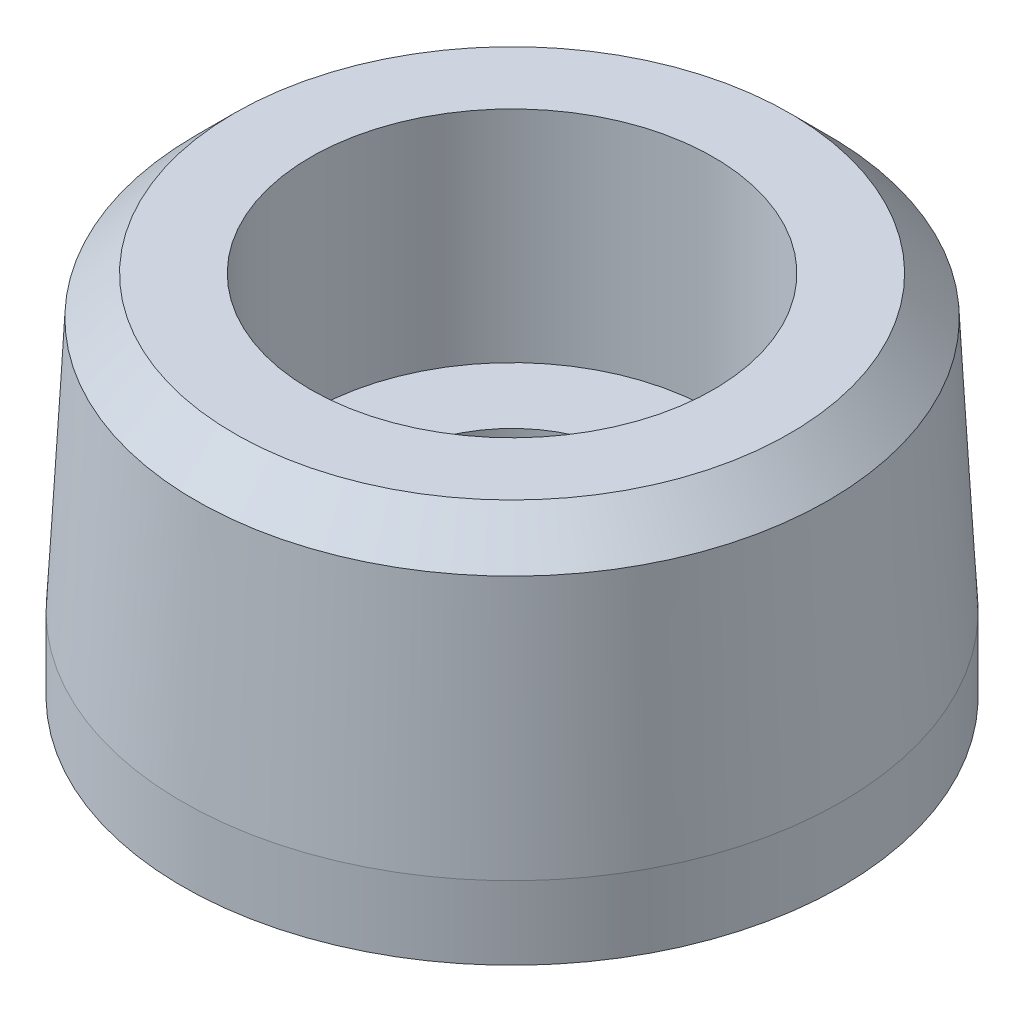
ISO-10303-21;
HEADER;
FILE_DESCRIPTION(('STEP AP214'),'2;1');
FILE_NAME('part.step','',(''),(''),'','','');
FILE_SCHEMA(('AUTOMOTIVE_DESIGN { 1 0 10303 214 1 1 1 1 }'));
ENDSEC;
DATA;
#1=APPLICATION_CONTEXT('core data for automotive mechanical design processes');
#2=APPLICATION_PROTOCOL_DEFINITION('international standard','automotive_design',2000,#1);
#3=PRODUCT_CONTEXT('',#1,'mechanical');
#4=PRODUCT('Part','Part','',(#3));
#5=PRODUCT_RELATED_PRODUCT_CATEGORY('part','',(#4));
#6=PRODUCT_DEFINITION_FORMATION('','',#4);
#7=PRODUCT_DEFINITION_CONTEXT('part definition',#1,'design');
#8=PRODUCT_DEFINITION('design','',#6,#7);
#9=PRODUCT_DEFINITION_SHAPE('','',#8);
#10=(LENGTH_UNIT() NAMED_UNIT(*) SI_UNIT(.MILLI.,.METRE.));
#11=(NAMED_UNIT(*) PLANE_ANGLE_UNIT() SI_UNIT($,.RADIAN.));
#12=(NAMED_UNIT(*) SI_UNIT($,.STERADIAN.) SOLID_ANGLE_UNIT());
#13=UNCERTAINTY_MEASURE_WITH_UNIT(LENGTH_MEASURE(1.E-05),#10,'distance_accuracy_value','');
#14=(GEOMETRIC_REPRESENTATION_CONTEXT(3) GLOBAL_UNCERTAINTY_ASSIGNED_CONTEXT((#13)) GLOBAL_UNIT_ASSIGNED_CONTEXT((#10,
#11,#12)) REPRESENTATION_CONTEXT('',''));
#15=CARTESIAN_POINT('',(0.,0.,0.));
#16=DIRECTION('',(0.,0.,1.));
#17=DIRECTION('',(1.,0.,0.));
#18=AXIS2_PLACEMENT_3D('',#15,#16,#17);
#19=CARTESIAN_POINT('',(0.,0.,0.));
#20=DIRECTION('',(0.,-1.,0.));
#21=DIRECTION('',(1.,0.,0.));
#22=AXIS2_PLACEMENT_3D('',#19,#20,#21);
#23=PLANE('',#22);
#24=CARTESIAN_POINT('',(0.,0.,0.));
#25=DIRECTION('',(0.,1.,0.));
#26=DIRECTION('',(0.,0.,1.));
#27=AXIS2_PLACEMENT_3D('',#24,#25,#26);
#28=CIRCLE('',#27,3.3);
#29=CARTESIAN_POINT('',(0.,0.,3.3));
#30=VERTEX_POINT('',#29);
#31=EDGE_CURVE('E53',#30,#30,#28,.T.);
#32=ORIENTED_EDGE('',*,*,#31,.T.);
#33=EDGE_LOOP('',(#32));
#34=FACE_BOUND('',#33,.T.);
#35=CARTESIAN_POINT('',(0.,0.,0.));
#36=DIRECTION('',(0.,-1.,0.));
#37=DIRECTION('',(1.,0.,0.));
#38=AXIS2_PLACEMENT_3D('',#35,#36,#37);
#39=CIRCLE('',#38,9.);
#40=CARTESIAN_POINT('',(9.,0.,0.));
#41=VERTEX_POINT('',#40);
#42=EDGE_CURVE('E44',#41,#41,#39,.T.);
#43=ORIENTED_EDGE('',*,*,#42,.T.);
#44=EDGE_LOOP('',(#43));
#45=FACE_BOUND('',#44,.T.);
#46=ADVANCED_FACE('F33',(#34,#45),#23,.T.);
#47=CARTESIAN_POINT('',(3.49148336110938E-12,-1000.,0.));
#48=DIRECTION('',(0.,-1.,0.));
#49=DIRECTION('',(1.,0.,0.));
#50=AXIS2_PLACEMENT_3D('',#47,#48,#49);
#51=CYLINDRICAL_SURFACE('',#50,9.);
#52=CARTESIAN_POINT('',(0.,2.,0.));
#53=DIRECTION('',(0.,-1.,0.));
#54=DIRECTION('',(1.,0.,0.));
#55=AXIS2_PLACEMENT_3D('',#52,#53,#54);
#56=CIRCLE('',#55,9.00000000000001);
#57=CARTESIAN_POINT('',(9.,2.00000000000003,0.));
#58=VERTEX_POINT('',#57);
#59=EDGE_CURVE('E48',#58,#58,#56,.T.);
#60=ORIENTED_EDGE('',*,*,#59,.T.);
#61=EDGE_LOOP('',(#60));
#62=FACE_BOUND('',#61,.T.);
#63=ORIENTED_EDGE('',*,*,#42,.F.);
#64=EDGE_LOOP('',(#63));
#65=FACE_BOUND('',#64,.T.);
#66=ADVANCED_FACE('F80',(#62,#65),#51,.T.);
#67=CARTESIAN_POINT('',(0.,2.,0.));
#68=DIRECTION('',(0.,-1.,0.));
#69=DIRECTION('',(1.,0.,0.));
#70=AXIS2_PLACEMENT_3D('',#67,#68,#69);
#71=CONICAL_SURFACE('',#70,9.00000000000001,0.0523598775598269);
#72=CARTESIAN_POINT('',(0.,8.94469374258541,0.));
#73=DIRECTION('',(0.,1.,0.));
#74=DIRECTION('',(-1.,0.,0.));
#75=AXIS2_PLACEMENT_3D('',#72,#73,#74);
#76=CIRCLE('',#75,8.63604402315029);
#77=CARTESIAN_POINT('',(-8.63604402315033,8.94469374258538,0.));
#78=VERTEX_POINT('',#77);
#79=EDGE_CURVE('E40',#78,#78,#76,.F.);
#80=ORIENTED_EDGE('',*,*,#79,.T.);
#81=EDGE_LOOP('',(#80));
#82=FACE_BOUND('',#81,.T.);
#83=ORIENTED_EDGE('',*,*,#59,.F.);
#84=EDGE_LOOP('',(#83));
#85=FACE_BOUND('',#84,.T.);
#86=ADVANCED_FACE('F71',(#82,#85),#71,.T.);
#87=CARTESIAN_POINT('',(8.58073776573567,10.,0.));
#88=DIRECTION('',(0.,1.,0.));
#89=DIRECTION('',(-1.,0.,0.));
#90=AXIS2_PLACEMENT_3D('',#87,#88,#89);
#91=PLANE('',#90);
#92=CARTESIAN_POINT('',(0.,9.99999999999998,0.));
#93=DIRECTION('',(0.,1.,0.));
#94=DIRECTION('',(-1.,0.,0.));
#95=AXIS2_PLACEMENT_3D('',#92,#93,#94);
#96=CIRCLE('',#95,7.58073776573572);
#97=CARTESIAN_POINT('',(-7.58073776573576,9.99999999999996,0.));
#98=VERTEX_POINT('',#97);
#99=EDGE_CURVE('E10',#98,#98,#96,.T.);
#100=ORIENTED_EDGE('',*,*,#99,.T.);
#101=EDGE_LOOP('',(#100));
#102=FACE_BOUND('',#101,.T.);
#103=CARTESIAN_POINT('',(0.,9.99999999999998,0.));
#104=DIRECTION('',(0.,1.,0.));
#105=DIRECTION('',(0.,0.,1.));
#106=AXIS2_PLACEMENT_3D('',#103,#104,#105);
#107=CIRCLE('',#106,5.5);
#108=CARTESIAN_POINT('',(0.,9.99999999999998,5.5));
#109=VERTEX_POINT('',#108);
#110=EDGE_CURVE('E62',#109,#109,#107,.T.);
#111=ORIENTED_EDGE('',*,*,#110,.F.);
#112=EDGE_LOOP('',(#111));
#113=FACE_BOUND('',#112,.T.);
#114=ADVANCED_FACE('F68',(#102,#113),#91,.T.);
#115=CARTESIAN_POINT('',(0.,9.99999999999998,0.));
#116=DIRECTION('',(0.,1.,0.));
#117=DIRECTION('',(0.,0.,1.));
#118=AXIS2_PLACEMENT_3D('',#115,#116,#117);
#119=CYLINDRICAL_SURFACE('',#118,3.3);
#120=ORIENTED_EDGE('',*,*,#31,.F.);
#121=EDGE_LOOP('',(#120));
#122=FACE_BOUND('',#121,.T.);
#123=CARTESIAN_POINT('',(0.,3.99999999999998,0.));
#124=DIRECTION('',(0.,1.,0.));
#125=DIRECTION('',(0.,0.,1.));
#126=AXIS2_PLACEMENT_3D('',#123,#124,#125);
#127=CIRCLE('',#126,3.3);
#128=CARTESIAN_POINT('',(0.,3.99999999999998,3.3));
#129=VERTEX_POINT('',#128);
#130=EDGE_CURVE('E56',#129,#129,#127,.T.);
#131=ORIENTED_EDGE('',*,*,#130,.T.);
#132=EDGE_LOOP('',(#131));
#133=FACE_BOUND('',#132,.T.);
#134=ADVANCED_FACE('F70',(#122,#133),#119,.F.);
#135=CARTESIAN_POINT('',(3.29999999999996,3.99999999999998,0.));
#136=DIRECTION('',(0.,-1.,0.));
#137=DIRECTION('',(0.,0.,-1.));
#138=AXIS2_PLACEMENT_3D('',#135,#136,#137);
#139=PLANE('',#138);
#140=ORIENTED_EDGE('',*,*,#130,.F.);
#141=EDGE_LOOP('',(#140));
#142=FACE_BOUND('',#141,.T.);
#143=CARTESIAN_POINT('',(0.,3.99999999999998,0.));
#144=DIRECTION('',(0.,1.,0.));
#145=DIRECTION('',(0.,0.,1.));
#146=AXIS2_PLACEMENT_3D('',#143,#144,#145);
#147=CIRCLE('',#146,5.5);
#148=CARTESIAN_POINT('',(0.,3.99999999999998,5.5));
#149=VERTEX_POINT('',#148);
#150=EDGE_CURVE('E59',#149,#149,#147,.T.);
#151=ORIENTED_EDGE('',*,*,#150,.T.);
#152=EDGE_LOOP('',(#151));
#153=FACE_BOUND('',#152,.T.);
#154=ADVANCED_FACE('F77',(#142,#153),#139,.F.);
#155=CARTESIAN_POINT('',(0.,9.99999999999998,0.));
#156=DIRECTION('',(0.,1.,0.));
#157=DIRECTION('',(0.,0.,1.));
#158=AXIS2_PLACEMENT_3D('',#155,#156,#157);
#159=CYLINDRICAL_SURFACE('',#158,5.5);
#160=ORIENTED_EDGE('',*,*,#150,.F.);
#161=EDGE_LOOP('',(#160));
#162=FACE_BOUND('',#161,.T.);
#163=ORIENTED_EDGE('',*,*,#110,.T.);
#164=EDGE_LOOP('',(#163));
#165=FACE_BOUND('',#164,.T.);
#166=ADVANCED_FACE('F66',(#162,#165),#159,.F.);
#167=CARTESIAN_POINT('',(0.,8.94469374258542,0.));
#168=DIRECTION('',(0.,-1.,0.));
#169=DIRECTION('',(1.,0.,0.));
#170=AXIS2_PLACEMENT_3D('',#167,#168,#169);
#171=CONICAL_SURFACE('',#170,8.63604402315029,0.785398163397451);
#172=ORIENTED_EDGE('',*,*,#99,.F.);
#173=EDGE_LOOP('',(#172));
#174=FACE_BOUND('',#173,.T.);
#175=ORIENTED_EDGE('',*,*,#79,.F.);
#176=EDGE_LOOP('',(#175));
#177=FACE_BOUND('',#176,.T.);
#178=ADVANCED_FACE('F35',(#174,#177),#171,.T.);
#179=CLOSED_SHELL('',(#46,#66,#86,#114,#134,#154,#166,#178));
#180=MANIFOLD_SOLID_BREP('B2',#179);
#181=ADVANCED_BREP_SHAPE_REPRESENTATION('',(#18,#180),#14);
#182=SHAPE_DEFINITION_REPRESENTATION(#9,#181);
ENDSEC;
END-ISO-10303-21;
